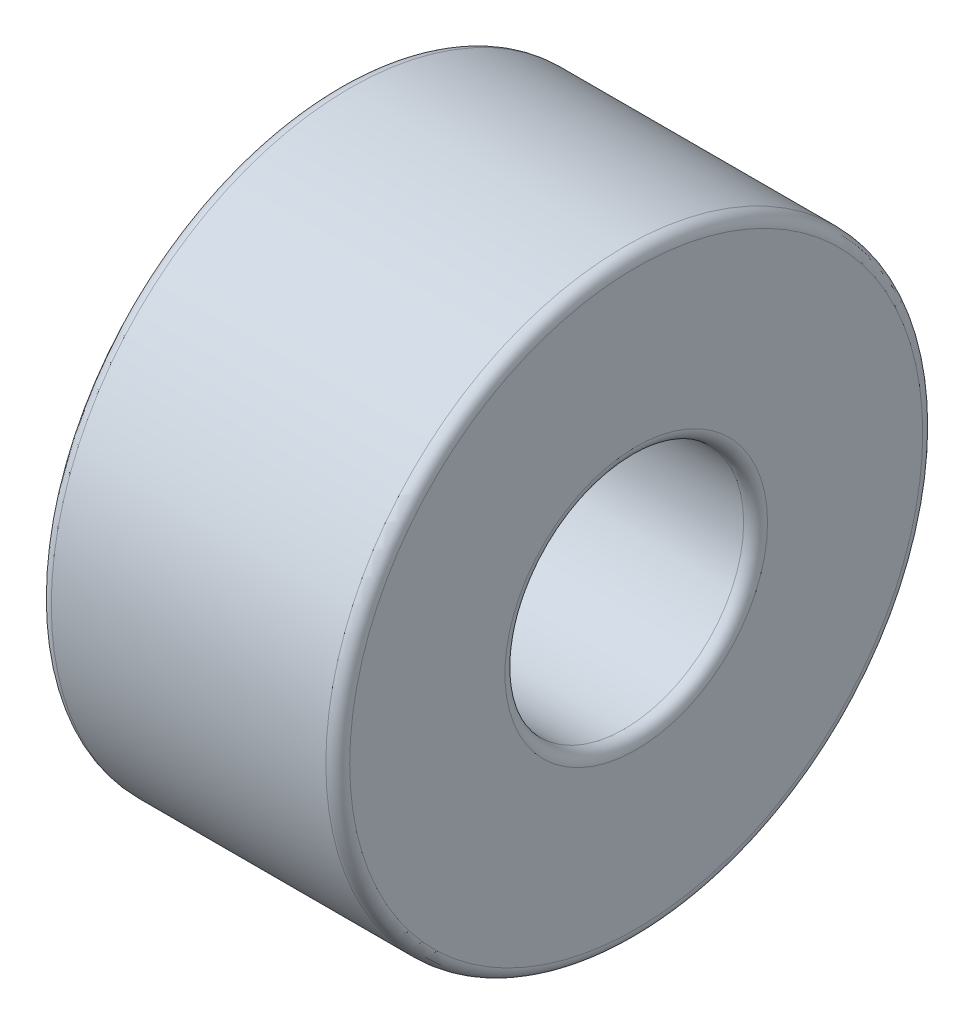
ISO-10303-21;
HEADER;
FILE_DESCRIPTION(('STEP AP214'),'2;1');
FILE_NAME('part.step','',(''),(''),'','','');
FILE_SCHEMA(('AUTOMOTIVE_DESIGN { 1 0 10303 214 1 1 1 1 }'));
ENDSEC;
DATA;
#1=APPLICATION_CONTEXT('core data for automotive mechanical design processes');
#2=APPLICATION_PROTOCOL_DEFINITION('international standard','automotive_design',2000,#1);
#3=PRODUCT_CONTEXT('',#1,'mechanical');
#4=PRODUCT('Part','Part','',(#3));
#5=PRODUCT_RELATED_PRODUCT_CATEGORY('part','',(#4));
#6=PRODUCT_DEFINITION_FORMATION('','',#4);
#7=PRODUCT_DEFINITION_CONTEXT('part definition',#1,'design');
#8=PRODUCT_DEFINITION('design','',#6,#7);
#9=PRODUCT_DEFINITION_SHAPE('','',#8);
#10=(LENGTH_UNIT() NAMED_UNIT(*) SI_UNIT(.MILLI.,.METRE.));
#11=(NAMED_UNIT(*) PLANE_ANGLE_UNIT() SI_UNIT($,.RADIAN.));
#12=(NAMED_UNIT(*) SI_UNIT($,.STERADIAN.) SOLID_ANGLE_UNIT());
#13=UNCERTAINTY_MEASURE_WITH_UNIT(LENGTH_MEASURE(1.E-05),#10,'distance_accuracy_value','');
#14=(GEOMETRIC_REPRESENTATION_CONTEXT(3) GLOBAL_UNCERTAINTY_ASSIGNED_CONTEXT((#13)) GLOBAL_UNIT_ASSIGNED_CONTEXT((#10,
#11,#12)) REPRESENTATION_CONTEXT('',''));
#15=CARTESIAN_POINT('',(0.,0.,0.));
#16=DIRECTION('',(0.,0.,1.));
#17=DIRECTION('',(1.,0.,0.));
#18=AXIS2_PLACEMENT_3D('',#15,#16,#17);
#19=CARTESIAN_POINT('',(2.5,0.,0.));
#20=DIRECTION('',(1.,0.,0.));
#21=DIRECTION('',(0.,0.,-1.));
#22=AXIS2_PLACEMENT_3D('',#19,#20,#21);
#23=PLANE('',#22);
#24=CARTESIAN_POINT('',(2.5,0.,0.));
#25=DIRECTION('',(1.,0.,0.));
#26=DIRECTION('',(0.,0.,-1.));
#27=AXIS2_PLACEMENT_3D('',#24,#25,#26);
#28=CIRCLE('',#27,1.1);
#29=CARTESIAN_POINT('',(2.5,0.,-1.1));
#30=VERTEX_POINT('',#29);
#31=EDGE_CURVE('E51',#30,#30,#28,.F.);
#32=ORIENTED_EDGE('',*,*,#31,.T.);
#33=EDGE_LOOP('',(#32));
#34=FACE_BOUND('',#33,.T.);
#35=CARTESIAN_POINT('',(2.5,0.,0.));
#36=DIRECTION('',(1.,0.,0.));
#37=DIRECTION('',(0.,0.,-1.));
#38=AXIS2_PLACEMENT_3D('',#35,#36,#37);
#39=CIRCLE('',#38,2.4);
#40=CARTESIAN_POINT('',(2.5,0.,-2.4));
#41=VERTEX_POINT('',#40);
#42=EDGE_CURVE('E60',#41,#41,#39,.T.);
#43=ORIENTED_EDGE('',*,*,#42,.T.);
#44=EDGE_LOOP('',(#43));
#45=FACE_BOUND('',#44,.T.);
#46=ADVANCED_FACE('F31',(#34,#45),#23,.T.);
#47=CARTESIAN_POINT('',(0.,0.,0.));
#48=DIRECTION('',(1.,0.,0.));
#49=DIRECTION('',(0.,0.,-1.));
#50=AXIS2_PLACEMENT_3D('',#47,#48,#49);
#51=PLANE('',#50);
#52=CARTESIAN_POINT('',(0.,0.,0.));
#53=DIRECTION('',(1.,0.,0.));
#54=DIRECTION('',(0.,0.,-1.));
#55=AXIS2_PLACEMENT_3D('',#52,#53,#54);
#56=CIRCLE('',#55,1.1);
#57=CARTESIAN_POINT('',(0.,0.,-1.1));
#58=VERTEX_POINT('',#57);
#59=EDGE_CURVE('E38',#58,#58,#56,.T.);
#60=ORIENTED_EDGE('',*,*,#59,.T.);
#61=EDGE_LOOP('',(#60));
#62=FACE_BOUND('',#61,.T.);
#63=CARTESIAN_POINT('',(0.,0.,0.));
#64=DIRECTION('',(1.,0.,0.));
#65=DIRECTION('',(0.,0.,-1.));
#66=AXIS2_PLACEMENT_3D('',#63,#64,#65);
#67=CIRCLE('',#66,2.4);
#68=CARTESIAN_POINT('',(0.,0.,-2.4));
#69=VERTEX_POINT('',#68);
#70=EDGE_CURVE('E42',#69,#69,#67,.F.);
#71=ORIENTED_EDGE('',*,*,#70,.T.);
#72=EDGE_LOOP('',(#71));
#73=FACE_BOUND('',#72,.T.);
#74=ADVANCED_FACE('F83',(#62,#73),#51,.F.);
#75=CARTESIAN_POINT('',(2.5,0.,0.));
#76=DIRECTION('',(-1.,0.,0.));
#77=DIRECTION('',(0.,0.,1.));
#78=AXIS2_PLACEMENT_3D('',#75,#76,#77);
#79=CYLINDRICAL_SURFACE('',#78,2.5);
#80=CARTESIAN_POINT('',(0.0999999999999998,0.,0.));
#81=DIRECTION('',(1.,0.,0.));
#82=DIRECTION('',(0.,0.,-1.));
#83=AXIS2_PLACEMENT_3D('',#80,#81,#82);
#84=CIRCLE('',#83,2.5);
#85=CARTESIAN_POINT('',(0.0999999999999998,0.,-2.5));
#86=VERTEX_POINT('',#85);
#87=EDGE_CURVE('E46',#86,#86,#84,.T.);
#88=ORIENTED_EDGE('',*,*,#87,.T.);
#89=EDGE_LOOP('',(#88));
#90=FACE_BOUND('',#89,.T.);
#91=CARTESIAN_POINT('',(2.4,0.,0.));
#92=DIRECTION('',(1.,0.,0.));
#93=DIRECTION('',(0.,0.,-1.));
#94=AXIS2_PLACEMENT_3D('',#91,#92,#93);
#95=CIRCLE('',#94,2.5);
#96=CARTESIAN_POINT('',(2.4,0.,-2.5));
#97=VERTEX_POINT('',#96);
#98=EDGE_CURVE('E57',#97,#97,#95,.F.);
#99=ORIENTED_EDGE('',*,*,#98,.T.);
#100=EDGE_LOOP('',(#99));
#101=FACE_BOUND('',#100,.T.);
#102=ADVANCED_FACE('F78',(#90,#101),#79,.T.);
#103=CARTESIAN_POINT('',(2.5,0.,0.));
#104=DIRECTION('',(-1.,0.,0.));
#105=DIRECTION('',(0.,0.,1.));
#106=AXIS2_PLACEMENT_3D('',#103,#104,#105);
#107=CYLINDRICAL_SURFACE('',#106,1.);
#108=CARTESIAN_POINT('',(0.0999999999999998,0.,0.));
#109=DIRECTION('',(1.,0.,0.));
#110=DIRECTION('',(0.,0.,-1.));
#111=AXIS2_PLACEMENT_3D('',#108,#109,#110);
#112=CIRCLE('',#111,1.);
#113=CARTESIAN_POINT('',(0.0999999999999998,0.,-1.));
#114=VERTEX_POINT('',#113);
#115=EDGE_CURVE('E10',#114,#114,#112,.F.);
#116=ORIENTED_EDGE('',*,*,#115,.T.);
#117=EDGE_LOOP('',(#116));
#118=FACE_BOUND('',#117,.T.);
#119=CARTESIAN_POINT('',(2.4,0.,0.));
#120=DIRECTION('',(1.,0.,0.));
#121=DIRECTION('',(0.,0.,-1.));
#122=AXIS2_PLACEMENT_3D('',#119,#120,#121);
#123=CIRCLE('',#122,1.);
#124=CARTESIAN_POINT('',(2.4,0.,-1.));
#125=VERTEX_POINT('',#124);
#126=EDGE_CURVE('E54',#125,#125,#123,.T.);
#127=ORIENTED_EDGE('',*,*,#126,.T.);
#128=EDGE_LOOP('',(#127));
#129=FACE_BOUND('',#128,.T.);
#130=ADVANCED_FACE('F68',(#118,#129),#107,.F.);
#131=CARTESIAN_POINT('',(2.4,0.,0.));
#132=DIRECTION('',(1.,0.,0.));
#133=DIRECTION('',(0.,0.,-1.));
#134=AXIS2_PLACEMENT_3D('',#131,#132,#133);
#135=TOROIDAL_SURFACE('',#134,2.4,0.1);
#136=ORIENTED_EDGE('',*,*,#98,.F.);
#137=EDGE_LOOP('',(#136));
#138=FACE_BOUND('',#137,.T.);
#139=ORIENTED_EDGE('',*,*,#42,.F.);
#140=EDGE_LOOP('',(#139));
#141=FACE_BOUND('',#140,.T.);
#142=ADVANCED_FACE('F65',(#138,#141),#135,.T.);
#143=CARTESIAN_POINT('',(2.4,0.,0.));
#144=DIRECTION('',(1.,0.,0.));
#145=DIRECTION('',(0.,0.,-1.));
#146=AXIS2_PLACEMENT_3D('',#143,#144,#145);
#147=TOROIDAL_SURFACE('',#146,1.1,0.1);
#148=ORIENTED_EDGE('',*,*,#31,.F.);
#149=EDGE_LOOP('',(#148));
#150=FACE_BOUND('',#149,.T.);
#151=ORIENTED_EDGE('',*,*,#126,.F.);
#152=EDGE_LOOP('',(#151));
#153=FACE_BOUND('',#152,.T.);
#154=ADVANCED_FACE('F67',(#150,#153),#147,.T.);
#155=CARTESIAN_POINT('',(0.0999999999999998,0.,0.));
#156=DIRECTION('',(1.,0.,0.));
#157=DIRECTION('',(0.,0.,-1.));
#158=AXIS2_PLACEMENT_3D('',#155,#156,#157);
#159=TOROIDAL_SURFACE('',#158,2.4,0.1);
#160=ORIENTED_EDGE('',*,*,#70,.F.);
#161=EDGE_LOOP('',(#160));
#162=FACE_BOUND('',#161,.T.);
#163=ORIENTED_EDGE('',*,*,#87,.F.);
#164=EDGE_LOOP('',(#163));
#165=FACE_BOUND('',#164,.T.);
#166=ADVANCED_FACE('F75',(#162,#165),#159,.T.);
#167=CARTESIAN_POINT('',(0.0999999999999998,0.,0.));
#168=DIRECTION('',(1.,0.,0.));
#169=DIRECTION('',(0.,0.,-1.));
#170=AXIS2_PLACEMENT_3D('',#167,#168,#169);
#171=TOROIDAL_SURFACE('',#170,1.1,0.1);
#172=ORIENTED_EDGE('',*,*,#115,.F.);
#173=EDGE_LOOP('',(#172));
#174=FACE_BOUND('',#173,.T.);
#175=ORIENTED_EDGE('',*,*,#59,.F.);
#176=EDGE_LOOP('',(#175));
#177=FACE_BOUND('',#176,.T.);
#178=ADVANCED_FACE('F33',(#174,#177),#171,.T.);
#179=CLOSED_SHELL('',(#46,#74,#102,#130,#142,#154,#166,#178));
#180=MANIFOLD_SOLID_BREP('B2',#179);
#181=ADVANCED_BREP_SHAPE_REPRESENTATION('',(#18,#180),#14);
#182=SHAPE_DEFINITION_REPRESENTATION(#9,#181);
ENDSEC;
END-ISO-10303-21;
